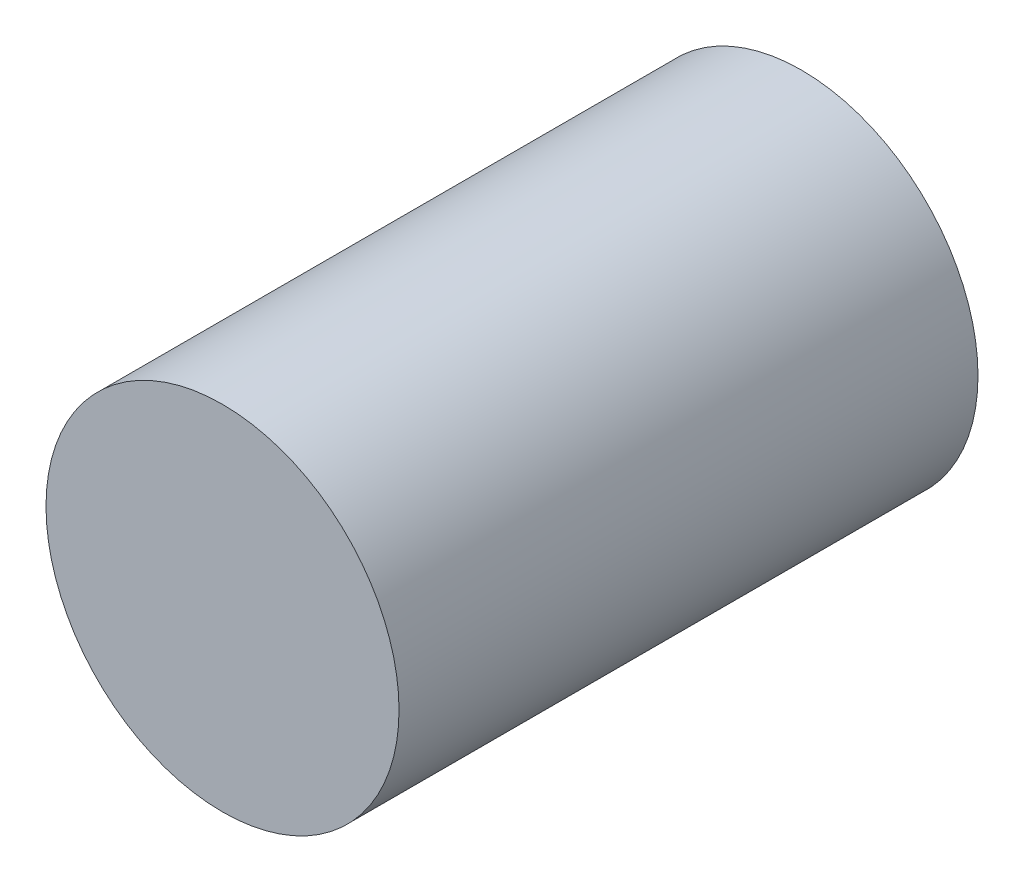
ISO-10303-21;
HEADER;
FILE_DESCRIPTION(('STEP AP214'),'2;1');
FILE_NAME('part.step','',(''),(''),'','','');
FILE_SCHEMA(('AUTOMOTIVE_DESIGN { 1 0 10303 214 1 1 1 1 }'));
ENDSEC;
DATA;
#1=APPLICATION_CONTEXT('core data for automotive mechanical design processes');
#2=APPLICATION_PROTOCOL_DEFINITION('international standard','automotive_design',2000,#1);
#3=PRODUCT_CONTEXT('',#1,'mechanical');
#4=PRODUCT('Part','Part','',(#3));
#5=PRODUCT_RELATED_PRODUCT_CATEGORY('part','',(#4));
#6=PRODUCT_DEFINITION_FORMATION('','',#4);
#7=PRODUCT_DEFINITION_CONTEXT('part definition',#1,'design');
#8=PRODUCT_DEFINITION('design','',#6,#7);
#9=PRODUCT_DEFINITION_SHAPE('','',#8);
#10=(LENGTH_UNIT() NAMED_UNIT(*) SI_UNIT(.MILLI.,.METRE.));
#11=(NAMED_UNIT(*) PLANE_ANGLE_UNIT() SI_UNIT($,.RADIAN.));
#12=(NAMED_UNIT(*) SI_UNIT($,.STERADIAN.) SOLID_ANGLE_UNIT());
#13=UNCERTAINTY_MEASURE_WITH_UNIT(LENGTH_MEASURE(1.E-05),#10,'distance_accuracy_value','');
#14=(GEOMETRIC_REPRESENTATION_CONTEXT(3) GLOBAL_UNCERTAINTY_ASSIGNED_CONTEXT((#13)) GLOBAL_UNIT_ASSIGNED_CONTEXT((#10,
#11,#12)) REPRESENTATION_CONTEXT('',''));
#15=CARTESIAN_POINT('',(0.,0.,0.));
#16=DIRECTION('',(0.,0.,1.));
#17=DIRECTION('',(1.,0.,0.));
#18=AXIS2_PLACEMENT_3D('',#15,#16,#17);
#19=CARTESIAN_POINT('',(0.,0.,82.));
#20=DIRECTION('',(0.,0.,-1.));
#21=DIRECTION('',(-1.,0.,0.));
#22=AXIS2_PLACEMENT_3D('',#19,#20,#21);
#23=CYLINDRICAL_SURFACE('',#22,25.);
#24=CARTESIAN_POINT('',(0.,0.,82.));
#25=DIRECTION('',(0.,0.,1.));
#26=DIRECTION('',(1.,0.,0.));
#27=AXIS2_PLACEMENT_3D('',#24,#25,#26);
#28=CIRCLE('',#27,25.);
#29=CARTESIAN_POINT('',(25.,0.,82.));
#30=VERTEX_POINT('',#29);
#31=EDGE_CURVE('E10',#30,#30,#28,.T.);
#32=ORIENTED_EDGE('',*,*,#31,.F.);
#33=EDGE_LOOP('',(#32));
#34=FACE_BOUND('',#33,.T.);
#35=CARTESIAN_POINT('',(0.,0.,0.));
#36=DIRECTION('',(0.,0.,1.));
#37=DIRECTION('',(1.,0.,0.));
#38=AXIS2_PLACEMENT_3D('',#35,#36,#37);
#39=CIRCLE('',#38,25.);
#40=CARTESIAN_POINT('',(25.,0.,0.));
#41=VERTEX_POINT('',#40);
#42=EDGE_CURVE('E38',#41,#41,#39,.T.);
#43=ORIENTED_EDGE('',*,*,#42,.T.);
#44=EDGE_LOOP('',(#43));
#45=FACE_BOUND('',#44,.T.);
#46=ADVANCED_FACE('F35',(#34,#45),#23,.T.);
#47=CARTESIAN_POINT('',(0.,0.,82.));
#48=DIRECTION('',(0.,0.,1.));
#49=DIRECTION('',(1.,0.,0.));
#50=AXIS2_PLACEMENT_3D('',#47,#48,#49);
#51=PLANE('',#50);
#52=ORIENTED_EDGE('',*,*,#31,.T.);
#53=EDGE_LOOP('',(#52));
#54=FACE_BOUND('',#53,.T.);
#55=ADVANCED_FACE('F50',(#54),#51,.T.);
#56=CARTESIAN_POINT('',(0.,0.,0.));
#57=DIRECTION('',(0.,0.,1.));
#58=DIRECTION('',(1.,0.,0.));
#59=AXIS2_PLACEMENT_3D('',#56,#57,#58);
#60=PLANE('',#59);
#61=ORIENTED_EDGE('',*,*,#42,.F.);
#62=EDGE_LOOP('',(#61));
#63=FACE_BOUND('',#62,.T.);
#64=ADVANCED_FACE('F48',(#63),#60,.F.);
#65=CLOSED_SHELL('',(#46,#55,#64));
#66=MANIFOLD_SOLID_BREP('B2',#65);
#67=ADVANCED_BREP_SHAPE_REPRESENTATION('',(#18,#66),#14);
#68=SHAPE_DEFINITION_REPRESENTATION(#9,#67);
ENDSEC;
END-ISO-10303-21;
